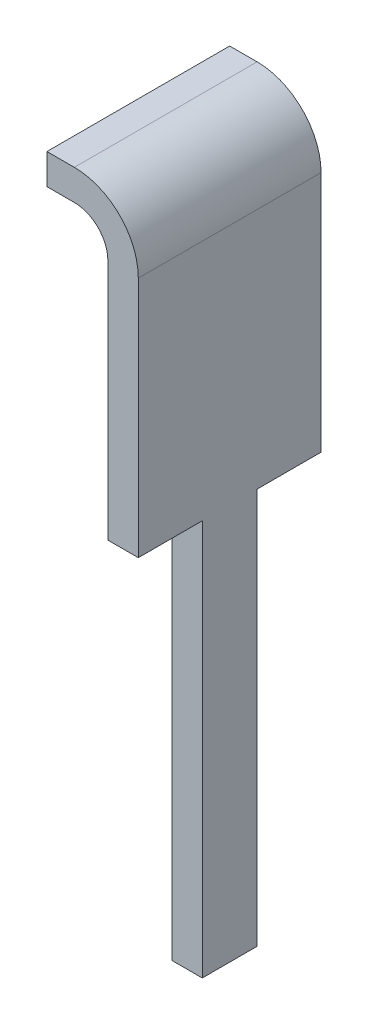
ISO-10303-21;
HEADER;
FILE_DESCRIPTION(('STEP AP214'),'2;1');
FILE_NAME('part.step','',(''),(''),'','','');
FILE_SCHEMA(('AUTOMOTIVE_DESIGN { 1 0 10303 214 1 1 1 1 }'));
ENDSEC;
DATA;
#1=APPLICATION_CONTEXT('core data for automotive mechanical design processes');
#2=APPLICATION_PROTOCOL_DEFINITION('international standard','automotive_design',2000,#1);
#3=PRODUCT_CONTEXT('',#1,'mechanical');
#4=PRODUCT('Part','Part','',(#3));
#5=PRODUCT_RELATED_PRODUCT_CATEGORY('part','',(#4));
#6=PRODUCT_DEFINITION_FORMATION('','',#4);
#7=PRODUCT_DEFINITION_CONTEXT('part definition',#1,'design');
#8=PRODUCT_DEFINITION('design','',#6,#7);
#9=PRODUCT_DEFINITION_SHAPE('','',#8);
#10=(LENGTH_UNIT() NAMED_UNIT(*) SI_UNIT(.MILLI.,.METRE.));
#11=(NAMED_UNIT(*) PLANE_ANGLE_UNIT() SI_UNIT($,.RADIAN.));
#12=(NAMED_UNIT(*) SI_UNIT($,.STERADIAN.) SOLID_ANGLE_UNIT());
#13=UNCERTAINTY_MEASURE_WITH_UNIT(LENGTH_MEASURE(1.E-05),#10,'distance_accuracy_value','');
#14=(GEOMETRIC_REPRESENTATION_CONTEXT(3) GLOBAL_UNCERTAINTY_ASSIGNED_CONTEXT((#13)) GLOBAL_UNIT_ASSIGNED_CONTEXT((#10,
#11,#12)) REPRESENTATION_CONTEXT('',''));
#15=CARTESIAN_POINT('',(0.,0.,0.));
#16=DIRECTION('',(0.,0.,1.));
#17=DIRECTION('',(1.,0.,0.));
#18=AXIS2_PLACEMENT_3D('',#15,#16,#17);
#19=CARTESIAN_POINT('',(0.508,-5.7277,-0.762));
#20=DIRECTION('',(0.,-1.,0.));
#21=DIRECTION('',(0.,0.,-1.));
#22=AXIS2_PLACEMENT_3D('',#19,#20,#21);
#23=PLANE('',#22);
#24=DIRECTION('',(0.,0.,1.));
#25=VECTOR('',#24,1.);
#26=CARTESIAN_POINT('',(0.762,-5.7277,-0.2286));
#27=LINE('',#26,#25);
#28=CARTESIAN_POINT('',(0.762,-5.7277,-0.2286));
#29=VERTEX_POINT('',#28);
#30=CARTESIAN_POINT('',(0.762,-5.7277,0.2286));
#31=VERTEX_POINT('',#30);
#32=EDGE_CURVE('E175',#29,#31,#27,.T.);
#33=ORIENTED_EDGE('',*,*,#32,.T.);
#34=DIRECTION('',(1.,0.,0.));
#35=VECTOR('',#34,1.);
#36=CARTESIAN_POINT('',(0.508,-5.7277,0.2286));
#37=LINE('',#36,#35);
#38=CARTESIAN_POINT('',(0.508,-5.7277,0.2286));
#39=VERTEX_POINT('',#38);
#40=EDGE_CURVE('E11',#39,#31,#37,.T.);
#41=ORIENTED_EDGE('',*,*,#40,.F.);
#42=DIRECTION('',(0.,0.,1.));
#43=VECTOR('',#42,1.);
#44=CARTESIAN_POINT('',(0.508,-5.7277,-0.2286));
#45=LINE('',#44,#43);
#46=CARTESIAN_POINT('',(0.508,-5.7277,-0.2286));
#47=VERTEX_POINT('',#46);
#48=EDGE_CURVE('E146',#47,#39,#45,.T.);
#49=ORIENTED_EDGE('',*,*,#48,.F.);
#50=DIRECTION('',(1.,0.,0.));
#51=VECTOR('',#50,1.);
#52=CARTESIAN_POINT('',(0.508,-5.7277,-0.2286));
#53=LINE('',#52,#51);
#54=EDGE_CURVE('E149',#47,#29,#53,.T.);
#55=ORIENTED_EDGE('',*,*,#54,.T.);
#56=EDGE_LOOP('',(#33,#41,#49,#55));
#57=FACE_BOUND('',#56,.T.);
#58=ADVANCED_FACE('F16',(#57),#23,.T.);
#59=CARTESIAN_POINT('',(0.762,-5.7277,0.2286));
#60=DIRECTION('',(0.,0.,-1.));
#61=DIRECTION('',(0.,-1.,0.));
#62=AXIS2_PLACEMENT_3D('',#59,#60,#61);
#63=PLANE('',#62);
#64=DIRECTION('',(-1.,0.,0.));
#65=VECTOR('',#64,1.);
#66=CARTESIAN_POINT('',(0.762,-2.4257,0.2286));
#67=LINE('',#66,#65);
#68=CARTESIAN_POINT('',(0.762,-2.4257,0.2286));
#69=VERTEX_POINT('',#68);
#70=CARTESIAN_POINT('',(0.508,-2.4257,0.2286));
#71=VERTEX_POINT('',#70);
#72=EDGE_CURVE('E27',#69,#71,#67,.T.);
#73=ORIENTED_EDGE('',*,*,#72,.T.);
#74=DIRECTION('',(0.,1.,0.));
#75=VECTOR('',#74,1.);
#76=CARTESIAN_POINT('',(0.508,-5.7277,0.2286));
#77=LINE('',#76,#75);
#78=EDGE_CURVE('E154',#39,#71,#77,.T.);
#79=ORIENTED_EDGE('',*,*,#78,.F.);
#80=ORIENTED_EDGE('',*,*,#40,.T.);
#81=DIRECTION('',(0.,1.,0.));
#82=VECTOR('',#81,1.);
#83=CARTESIAN_POINT('',(0.762,-5.7277,0.2286));
#84=LINE('',#83,#82);
#85=EDGE_CURVE('E189',#31,#69,#84,.T.);
#86=ORIENTED_EDGE('',*,*,#85,.T.);
#87=EDGE_LOOP('',(#73,#79,#80,#86));
#88=FACE_BOUND('',#87,.T.);
#89=ADVANCED_FACE('F18',(#88),#63,.F.);
#90=CARTESIAN_POINT('',(0.762,-2.4257,0.2286));
#91=DIRECTION('',(0.,1.,0.));
#92=DIRECTION('',(1.,0.,0.));
#93=AXIS2_PLACEMENT_3D('',#90,#91,#92);
#94=PLANE('',#93);
#95=DIRECTION('',(0.,0.,-1.));
#96=VECTOR('',#95,1.);
#97=CARTESIAN_POINT('',(0.508,-2.4257,0.762));
#98=LINE('',#97,#96);
#99=CARTESIAN_POINT('',(0.508,-2.4257,0.762));
#100=VERTEX_POINT('',#99);
#101=EDGE_CURVE('E207',#100,#71,#98,.T.);
#102=ORIENTED_EDGE('',*,*,#101,.T.);
#103=ORIENTED_EDGE('',*,*,#72,.F.);
#104=DIRECTION('',(0.,0.,-1.));
#105=VECTOR('',#104,1.);
#106=CARTESIAN_POINT('',(0.762,-2.4257,0.762));
#107=LINE('',#106,#105);
#108=CARTESIAN_POINT('',(0.762,-2.4257,0.762));
#109=VERTEX_POINT('',#108);
#110=EDGE_CURVE('E198',#109,#69,#107,.T.);
#111=ORIENTED_EDGE('',*,*,#110,.F.);
#112=DIRECTION('',(1.,0.,0.));
#113=VECTOR('',#112,1.);
#114=CARTESIAN_POINT('',(0.508,-2.4257,0.762));
#115=LINE('',#114,#113);
#116=EDGE_CURVE('E195',#100,#109,#115,.T.);
#117=ORIENTED_EDGE('',*,*,#116,.F.);
#118=EDGE_LOOP('',(#102,#103,#111,#117));
#119=FACE_BOUND('',#118,.T.);
#120=ADVANCED_FACE('F312',(#119),#94,.F.);
#121=CARTESIAN_POINT('',(0.,0.,0.762));
#122=DIRECTION('',(0.,0.,1.));
#123=DIRECTION('',(1.,0.,0.));
#124=AXIS2_PLACEMENT_3D('',#121,#122,#123);
#125=PLANE('',#124);
#126=DIRECTION('',(0.,1.,0.));
#127=VECTOR('',#126,1.);
#128=CARTESIAN_POINT('',(0.762,-2.4257,0.762));
#129=LINE('',#128,#127);
#130=CARTESIAN_POINT('',(0.762,-0.4064,0.762));
#131=VERTEX_POINT('',#130);
#132=EDGE_CURVE('E202',#109,#131,#129,.T.);
#133=ORIENTED_EDGE('',*,*,#132,.T.);
#134=CARTESIAN_POINT('',(0.2286,-0.4064,0.762));
#135=DIRECTION('',(0.,0.,1.));
#136=DIRECTION('',(1.,0.,0.));
#137=AXIS2_PLACEMENT_3D('',#134,#135,#136);
#138=CIRCLE('',#137,0.5334);
#139=CARTESIAN_POINT('',(0.2286,0.127,0.762));
#140=VERTEX_POINT('',#139);
#141=EDGE_CURVE('E39',#131,#140,#138,.T.);
#142=ORIENTED_EDGE('',*,*,#141,.T.);
#143=DIRECTION('',(-1.,0.,0.));
#144=VECTOR('',#143,1.);
#145=CARTESIAN_POINT('',(0.2286,0.127,0.762));
#146=LINE('',#145,#144);
#147=CARTESIAN_POINT('',(0.,0.127,0.762));
#148=VERTEX_POINT('',#147);
#149=EDGE_CURVE('E211',#140,#148,#146,.T.);
#150=ORIENTED_EDGE('',*,*,#149,.T.);
#151=DIRECTION('',(0.,-1.,0.));
#152=VECTOR('',#151,1.);
#153=CARTESIAN_POINT('',(0.,0.127,0.762));
#154=LINE('',#153,#152);
#155=CARTESIAN_POINT('',(0.,-0.127,0.762));
#156=VERTEX_POINT('',#155);
#157=EDGE_CURVE('E225',#148,#156,#154,.T.);
#158=ORIENTED_EDGE('',*,*,#157,.T.);
#159=DIRECTION('',(1.,0.,0.));
#160=VECTOR('',#159,1.);
#161=CARTESIAN_POINT('',(0.,-0.127,0.762));
#162=LINE('',#161,#160);
#163=CARTESIAN_POINT('',(0.2286,-0.127,0.762));
#164=VERTEX_POINT('',#163);
#165=EDGE_CURVE('E190',#156,#164,#162,.T.);
#166=ORIENTED_EDGE('',*,*,#165,.T.);
#167=CARTESIAN_POINT('',(0.2286,-0.4064,0.762));
#168=DIRECTION('',(0.,0.,-1.));
#169=DIRECTION('',(0.,1.,0.));
#170=AXIS2_PLACEMENT_3D('',#167,#168,#169);
#171=CIRCLE('',#170,0.2794);
#172=CARTESIAN_POINT('',(0.508,-0.4064,0.762));
#173=VERTEX_POINT('',#172);
#174=EDGE_CURVE('E249',#164,#173,#171,.T.);
#175=ORIENTED_EDGE('',*,*,#174,.T.);
#176=DIRECTION('',(0.,-1.,0.));
#177=VECTOR('',#176,1.);
#178=CARTESIAN_POINT('',(0.508,-0.4064,0.762));
#179=LINE('',#178,#177);
#180=EDGE_CURVE('E252',#173,#100,#179,.T.);
#181=ORIENTED_EDGE('',*,*,#180,.T.);
#182=ORIENTED_EDGE('',*,*,#116,.T.);
#183=EDGE_LOOP('',(#133,#142,#150,#158,#166,#175,#181,#182));
#184=FACE_BOUND('',#183,.T.);
#185=ADVANCED_FACE('F288',(#184),#125,.T.);
#186=CARTESIAN_POINT('',(0.2286,-0.4064,-0.762));
#187=DIRECTION('',(0.,0.,1.));
#188=DIRECTION('',(1.,0.,0.));
#189=AXIS2_PLACEMENT_3D('',#186,#187,#188);
#190=CYLINDRICAL_SURFACE('',#189,0.5334);
#191=DIRECTION('',(0.,0.,1.));
#192=VECTOR('',#191,1.);
#193=CARTESIAN_POINT('',(0.2286,0.127,-0.762));
#194=LINE('',#193,#192);
#195=CARTESIAN_POINT('',(0.2286,0.127,-0.762));
#196=VERTEX_POINT('',#195);
#197=EDGE_CURVE('E196',#196,#140,#194,.T.);
#198=ORIENTED_EDGE('',*,*,#197,.T.);
#199=ORIENTED_EDGE('',*,*,#141,.F.);
#200=DIRECTION('',(0.,0.,1.));
#201=VECTOR('',#200,1.);
#202=CARTESIAN_POINT('',(0.762,-0.4064,-0.762));
#203=LINE('',#202,#201);
#204=CARTESIAN_POINT('',(0.762,-0.4064,-0.762));
#205=VERTEX_POINT('',#204);
#206=EDGE_CURVE('E210',#205,#131,#203,.T.);
#207=ORIENTED_EDGE('',*,*,#206,.F.);
#208=CARTESIAN_POINT('',(0.2286,-0.4064,-0.762));
#209=DIRECTION('',(0.,0.,1.));
#210=DIRECTION('',(1.,0.,0.));
#211=AXIS2_PLACEMENT_3D('',#208,#209,#210);
#212=CIRCLE('',#211,0.5334);
#213=EDGE_CURVE('E186',#205,#196,#212,.T.);
#214=ORIENTED_EDGE('',*,*,#213,.T.);
#215=EDGE_LOOP('',(#198,#199,#207,#214));
#216=FACE_BOUND('',#215,.T.);
#217=ADVANCED_FACE('F317',(#216),#190,.T.);
#218=CARTESIAN_POINT('',(0.2286,0.127,-0.762));
#219=DIRECTION('',(0.,1.,0.));
#220=DIRECTION('',(1.,0.,0.));
#221=AXIS2_PLACEMENT_3D('',#218,#219,#220);
#222=PLANE('',#221);
#223=DIRECTION('',(0.,0.,1.));
#224=VECTOR('',#223,1.);
#225=CARTESIAN_POINT('',(0.,0.127,-0.762));
#226=LINE('',#225,#224);
#227=CARTESIAN_POINT('',(0.,0.127,-0.762));
#228=VERTEX_POINT('',#227);
#229=EDGE_CURVE('E214',#228,#148,#226,.T.);
#230=ORIENTED_EDGE('',*,*,#229,.T.);
#231=ORIENTED_EDGE('',*,*,#149,.F.);
#232=ORIENTED_EDGE('',*,*,#197,.F.);
#233=DIRECTION('',(-1.,0.,0.));
#234=VECTOR('',#233,1.);
#235=CARTESIAN_POINT('',(0.2286,0.127,-0.762));
#236=LINE('',#235,#234);
#237=EDGE_CURVE('E228',#196,#228,#236,.T.);
#238=ORIENTED_EDGE('',*,*,#237,.T.);
#239=EDGE_LOOP('',(#230,#231,#232,#238));
#240=FACE_BOUND('',#239,.T.);
#241=ADVANCED_FACE('F318',(#240),#222,.T.);
#242=CARTESIAN_POINT('',(0.,0.127,-0.762));
#243=DIRECTION('',(-1.,0.,0.));
#244=DIRECTION('',(0.,0.,1.));
#245=AXIS2_PLACEMENT_3D('',#242,#243,#244);
#246=PLANE('',#245);
#247=DIRECTION('',(0.,0.,1.));
#248=VECTOR('',#247,1.);
#249=CARTESIAN_POINT('',(0.,-0.127,-0.762));
#250=LINE('',#249,#248);
#251=CARTESIAN_POINT('',(0.,-0.127,-0.762));
#252=VERTEX_POINT('',#251);
#253=EDGE_CURVE('E102',#252,#156,#250,.T.);
#254=ORIENTED_EDGE('',*,*,#253,.T.);
#255=ORIENTED_EDGE('',*,*,#157,.F.);
#256=ORIENTED_EDGE('',*,*,#229,.F.);
#257=DIRECTION('',(0.,-1.,0.));
#258=VECTOR('',#257,1.);
#259=CARTESIAN_POINT('',(0.,0.127,-0.762));
#260=LINE('',#259,#258);
#261=EDGE_CURVE('E218',#228,#252,#260,.T.);
#262=ORIENTED_EDGE('',*,*,#261,.T.);
#263=EDGE_LOOP('',(#254,#255,#256,#262));
#264=FACE_BOUND('',#263,.T.);
#265=ADVANCED_FACE('F290',(#264),#246,.T.);
#266=CARTESIAN_POINT('',(0.,-0.127,-0.762));
#267=DIRECTION('',(0.,-1.,0.));
#268=DIRECTION('',(0.,0.,-1.));
#269=AXIS2_PLACEMENT_3D('',#266,#267,#268);
#270=PLANE('',#269);
#271=DIRECTION('',(0.,0.,1.));
#272=VECTOR('',#271,1.);
#273=CARTESIAN_POINT('',(0.2286,-0.127,-0.762));
#274=LINE('',#273,#272);
#275=CARTESIAN_POINT('',(0.2286,-0.127,-0.762));
#276=VERTEX_POINT('',#275);
#277=EDGE_CURVE('E91',#276,#164,#274,.T.);
#278=ORIENTED_EDGE('',*,*,#277,.T.);
#279=ORIENTED_EDGE('',*,*,#165,.F.);
#280=ORIENTED_EDGE('',*,*,#253,.F.);
#281=DIRECTION('',(1.,0.,0.));
#282=VECTOR('',#281,1.);
#283=CARTESIAN_POINT('',(0.,-0.127,-0.762));
#284=LINE('',#283,#282);
#285=EDGE_CURVE('E215',#252,#276,#284,.T.);
#286=ORIENTED_EDGE('',*,*,#285,.T.);
#287=EDGE_LOOP('',(#278,#279,#280,#286));
#288=FACE_BOUND('',#287,.T.);
#289=ADVANCED_FACE('F292',(#288),#270,.T.);
#290=CARTESIAN_POINT('',(0.2286,-0.4064,-0.762));
#291=DIRECTION('',(0.,0.,1.));
#292=DIRECTION('',(1.,0.,0.));
#293=AXIS2_PLACEMENT_3D('',#290,#291,#292);
#294=CYLINDRICAL_SURFACE('',#293,0.2794);
#295=DIRECTION('',(0.,0.,1.));
#296=VECTOR('',#295,1.);
#297=CARTESIAN_POINT('',(0.508,-0.4064,-0.762));
#298=LINE('',#297,#296);
#299=CARTESIAN_POINT('',(0.508,-0.4064,-0.762));
#300=VERTEX_POINT('',#299);
#301=EDGE_CURVE('E256',#300,#173,#298,.T.);
#302=ORIENTED_EDGE('',*,*,#301,.T.);
#303=ORIENTED_EDGE('',*,*,#174,.F.);
#304=ORIENTED_EDGE('',*,*,#277,.F.);
#305=CARTESIAN_POINT('',(0.2286,-0.4064,-0.762));
#306=DIRECTION('',(0.,0.,-1.));
#307=DIRECTION('',(0.,1.,0.));
#308=AXIS2_PLACEMENT_3D('',#305,#306,#307);
#309=CIRCLE('',#308,0.2794);
#310=EDGE_CURVE('E219',#276,#300,#309,.T.);
#311=ORIENTED_EDGE('',*,*,#310,.T.);
#312=EDGE_LOOP('',(#302,#303,#304,#311));
#313=FACE_BOUND('',#312,.T.);
#314=ADVANCED_FACE('F294',(#313),#294,.F.);
#315=CARTESIAN_POINT('',(0.508,-0.4064,-0.762));
#316=DIRECTION('',(-1.,0.,0.));
#317=DIRECTION('',(0.,0.,1.));
#318=AXIS2_PLACEMENT_3D('',#315,#316,#317);
#319=PLANE('',#318);
#320=ORIENTED_EDGE('',*,*,#48,.T.);
#321=ORIENTED_EDGE('',*,*,#78,.T.);
#322=ORIENTED_EDGE('',*,*,#101,.F.);
#323=ORIENTED_EDGE('',*,*,#180,.F.);
#324=ORIENTED_EDGE('',*,*,#301,.F.);
#325=DIRECTION('',(0.,-1.,0.));
#326=VECTOR('',#325,1.);
#327=CARTESIAN_POINT('',(0.508,-0.4064,-0.762));
#328=LINE('',#327,#326);
#329=CARTESIAN_POINT('',(0.508,-2.4257,-0.762));
#330=VERTEX_POINT('',#329);
#331=EDGE_CURVE('E179',#300,#330,#328,.T.);
#332=ORIENTED_EDGE('',*,*,#331,.T.);
#333=DIRECTION('',(0.,0.,-1.));
#334=VECTOR('',#333,1.);
#335=CARTESIAN_POINT('',(0.508,-2.4257,-0.2286));
#336=LINE('',#335,#334);
#337=CARTESIAN_POINT('',(0.508,-2.4257,-0.2286));
#338=VERTEX_POINT('',#337);
#339=EDGE_CURVE('E20',#338,#330,#336,.T.);
#340=ORIENTED_EDGE('',*,*,#339,.F.);
#341=DIRECTION('',(0.,1.,0.));
#342=VECTOR('',#341,1.);
#343=CARTESIAN_POINT('',(0.508,-5.7277,-0.2286));
#344=LINE('',#343,#342);
#345=EDGE_CURVE('E157',#47,#338,#344,.T.);
#346=ORIENTED_EDGE('',*,*,#345,.F.);
#347=EDGE_LOOP('',(#320,#321,#322,#323,#324,#332,#340,#346));
#348=FACE_BOUND('',#347,.T.);
#349=ADVANCED_FACE('F158',(#348),#319,.T.);
#350=CARTESIAN_POINT('',(0.762,-2.4257,-0.2286));
#351=DIRECTION('',(0.,-1.,0.));
#352=DIRECTION('',(0.,0.,-1.));
#353=AXIS2_PLACEMENT_3D('',#350,#351,#352);
#354=PLANE('',#353);
#355=DIRECTION('',(-1.,0.,0.));
#356=VECTOR('',#355,1.);
#357=CARTESIAN_POINT('',(0.762,-2.4257,-0.2286));
#358=LINE('',#357,#356);
#359=CARTESIAN_POINT('',(0.762,-2.4257,-0.2286));
#360=VERTEX_POINT('',#359);
#361=EDGE_CURVE('E163',#360,#338,#358,.T.);
#362=ORIENTED_EDGE('',*,*,#361,.T.);
#363=ORIENTED_EDGE('',*,*,#339,.T.);
#364=DIRECTION('',(1.,0.,0.));
#365=VECTOR('',#364,1.);
#366=CARTESIAN_POINT('',(0.508,-2.4257,-0.762));
#367=LINE('',#366,#365);
#368=CARTESIAN_POINT('',(0.762,-2.4257,-0.762));
#369=VERTEX_POINT('',#368);
#370=EDGE_CURVE('E275',#330,#369,#367,.T.);
#371=ORIENTED_EDGE('',*,*,#370,.T.);
#372=DIRECTION('',(0.,0.,-1.));
#373=VECTOR('',#372,1.);
#374=CARTESIAN_POINT('',(0.762,-2.4257,-0.2286));
#375=LINE('',#374,#373);
#376=EDGE_CURVE('E185',#360,#369,#375,.T.);
#377=ORIENTED_EDGE('',*,*,#376,.F.);
#378=EDGE_LOOP('',(#362,#363,#371,#377));
#379=FACE_BOUND('',#378,.T.);
#380=ADVANCED_FACE('F302',(#379),#354,.T.);
#381=CARTESIAN_POINT('',(0.762,-5.7277,-0.2286));
#382=DIRECTION('',(0.,0.,-1.));
#383=DIRECTION('',(0.,-1.,0.));
#384=AXIS2_PLACEMENT_3D('',#381,#382,#383);
#385=PLANE('',#384);
#386=ORIENTED_EDGE('',*,*,#54,.F.);
#387=ORIENTED_EDGE('',*,*,#345,.T.);
#388=ORIENTED_EDGE('',*,*,#361,.F.);
#389=DIRECTION('',(0.,1.,0.));
#390=VECTOR('',#389,1.);
#391=CARTESIAN_POINT('',(0.762,-5.7277,-0.2286));
#392=LINE('',#391,#390);
#393=EDGE_CURVE('E167',#29,#360,#392,.T.);
#394=ORIENTED_EDGE('',*,*,#393,.F.);
#395=EDGE_LOOP('',(#386,#387,#388,#394));
#396=FACE_BOUND('',#395,.T.);
#397=ADVANCED_FACE('F165',(#396),#385,.T.);
#398=CARTESIAN_POINT('',(0.762,-5.7277,-0.762));
#399=DIRECTION('',(1.,0.,0.));
#400=DIRECTION('',(0.,1.,0.));
#401=AXIS2_PLACEMENT_3D('',#398,#399,#400);
#402=PLANE('',#401);
#403=ORIENTED_EDGE('',*,*,#376,.T.);
#404=DIRECTION('',(0.,1.,0.));
#405=VECTOR('',#404,1.);
#406=CARTESIAN_POINT('',(0.762,-2.4257,-0.762));
#407=LINE('',#406,#405);
#408=EDGE_CURVE('E181',#369,#205,#407,.T.);
#409=ORIENTED_EDGE('',*,*,#408,.T.);
#410=ORIENTED_EDGE('',*,*,#206,.T.);
#411=ORIENTED_EDGE('',*,*,#132,.F.);
#412=ORIENTED_EDGE('',*,*,#110,.T.);
#413=ORIENTED_EDGE('',*,*,#85,.F.);
#414=ORIENTED_EDGE('',*,*,#32,.F.);
#415=ORIENTED_EDGE('',*,*,#393,.T.);
#416=EDGE_LOOP('',(#403,#409,#410,#411,#412,#413,#414,#415));
#417=FACE_BOUND('',#416,.T.);
#418=ADVANCED_FACE('F331',(#417),#402,.T.);
#419=CARTESIAN_POINT('',(0.,0.,-0.762));
#420=DIRECTION('',(0.,0.,1.));
#421=DIRECTION('',(1.,0.,0.));
#422=AXIS2_PLACEMENT_3D('',#419,#420,#421);
#423=PLANE('',#422);
#424=ORIENTED_EDGE('',*,*,#370,.F.);
#425=ORIENTED_EDGE('',*,*,#331,.F.);
#426=ORIENTED_EDGE('',*,*,#310,.F.);
#427=ORIENTED_EDGE('',*,*,#285,.F.);
#428=ORIENTED_EDGE('',*,*,#261,.F.);
#429=ORIENTED_EDGE('',*,*,#237,.F.);
#430=ORIENTED_EDGE('',*,*,#213,.F.);
#431=ORIENTED_EDGE('',*,*,#408,.F.);
#432=EDGE_LOOP('',(#424,#425,#426,#427,#428,#429,#430,#431));
#433=FACE_BOUND('',#432,.T.);
#434=ADVANCED_FACE('F333',(#433),#423,.F.);
#435=CLOSED_SHELL('',(#58,#89,#120,#185,#217,#241,#265,#289,#314,#349,#380,#397,#418,#434));
#436=MANIFOLD_SOLID_BREP('B1',#435);
#437=ADVANCED_BREP_SHAPE_REPRESENTATION('',(#18,#436),#14);
#438=SHAPE_DEFINITION_REPRESENTATION(#9,#437);
ENDSEC;
END-ISO-10303-21;
